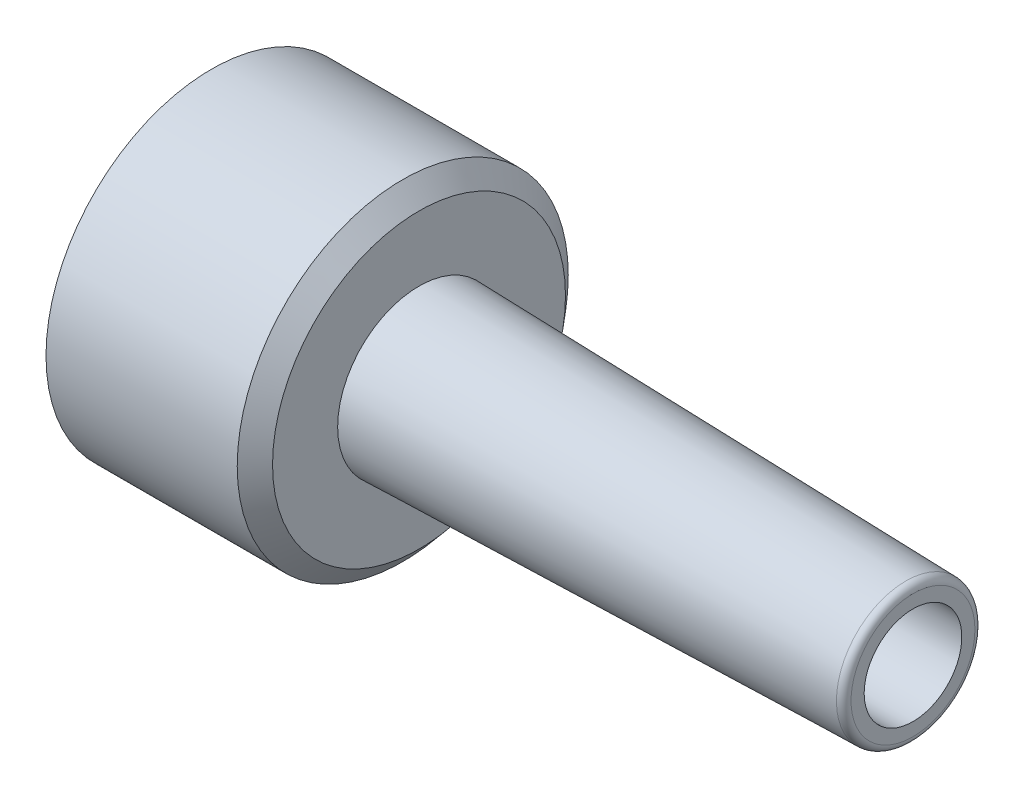
ISO-10303-21;
HEADER;
FILE_DESCRIPTION(('STEP AP214'),'2;1');
FILE_NAME('part.step','',(''),(''),'','','');
FILE_SCHEMA(('AUTOMOTIVE_DESIGN { 1 0 10303 214 1 1 1 1 }'));
ENDSEC;
DATA;
#1=APPLICATION_CONTEXT('core data for automotive mechanical design processes');
#2=APPLICATION_PROTOCOL_DEFINITION('international standard','automotive_design',2000,#1);
#3=PRODUCT_CONTEXT('',#1,'mechanical');
#4=PRODUCT('Part','Part','',(#3));
#5=PRODUCT_RELATED_PRODUCT_CATEGORY('part','',(#4));
#6=PRODUCT_DEFINITION_FORMATION('','',#4);
#7=PRODUCT_DEFINITION_CONTEXT('part definition',#1,'design');
#8=PRODUCT_DEFINITION('design','',#6,#7);
#9=PRODUCT_DEFINITION_SHAPE('','',#8);
#10=(LENGTH_UNIT() NAMED_UNIT(*) SI_UNIT(.MILLI.,.METRE.));
#11=(NAMED_UNIT(*) PLANE_ANGLE_UNIT() SI_UNIT($,.RADIAN.));
#12=(NAMED_UNIT(*) SI_UNIT($,.STERADIAN.) SOLID_ANGLE_UNIT());
#13=UNCERTAINTY_MEASURE_WITH_UNIT(LENGTH_MEASURE(1.E-05),#10,'distance_accuracy_value','');
#14=(GEOMETRIC_REPRESENTATION_CONTEXT(3) GLOBAL_UNCERTAINTY_ASSIGNED_CONTEXT((#13)) GLOBAL_UNIT_ASSIGNED_CONTEXT((#10,
#11,#12)) REPRESENTATION_CONTEXT('',''));
#15=CARTESIAN_POINT('',(0.,0.,0.));
#16=DIRECTION('',(0.,0.,1.));
#17=DIRECTION('',(1.,0.,0.));
#18=AXIS2_PLACEMENT_3D('',#15,#16,#17);
#19=CARTESIAN_POINT('',(0.,0.,0.));
#20=DIRECTION('',(-1.,0.,0.));
#21=DIRECTION('',(0.,0.,1.));
#22=AXIS2_PLACEMENT_3D('',#19,#20,#21);
#23=CYLINDRICAL_SURFACE('',#22,44.75);
#24=CARTESIAN_POINT('',(18.15,0.,-44.75));
#25=CARTESIAN_POINT('',(18.1499945488722,-0.123494927749459,-44.7499992762293));
#26=CARTESIAN_POINT('',(18.1395666697579,-0.247077499740812,-44.7494833178904));
#27=CARTESIAN_POINT('',(18.0981155717469,-0.490833627326368,-44.7474746598635));
#28=CARTESIAN_POINT('',(18.0670680693841,-0.611002989017102,-44.7459808085532));
#29=CARTESIAN_POINT('',(17.985268628475,-0.844366365600112,-44.7421854484618));
#30=CARTESIAN_POINT('',(17.9345267110427,-0.957563894085092,-44.7398843504894));
#31=CARTESIAN_POINT('',(17.8147941624646,-1.17380393254304,-44.7347336770827));
#32=CARTESIAN_POINT('',(17.7458078467614,-1.27684883606841,-44.7318842313954));
#33=CARTESIAN_POINT('',(17.5914692931732,-1.46999041533409,-44.7259542969457));
#34=CARTESIAN_POINT('',(17.5061030660289,-1.56007590718528,-44.7228736120729));
#35=CARTESIAN_POINT('',(17.3214557660902,-1.72464619438284,-44.7168301035337));
#36=CARTESIAN_POINT('',(17.2221741259064,-1.79913035328883,-44.7138672846796));
#37=CARTESIAN_POINT('',(17.012455991485,-1.93041415219686,-44.7083922360849));
#38=CARTESIAN_POINT('',(16.9020140547964,-1.98720510824268,-44.7058802278612));
#39=CARTESIAN_POINT('',(16.6731486896993,-2.08143468651145,-44.7015924477393));
#40=CARTESIAN_POINT('',(16.5547253203789,-2.11887345198473,-44.6998166703915));
#41=CARTESIAN_POINT('',(16.3133611326149,-2.1733064871318,-44.6972033658363));
#42=CARTESIAN_POINT('',(16.1904240801871,-2.19031741858537,-44.6963650740157));
#43=CARTESIAN_POINT('',(15.9434367404799,-2.20346331292136,-44.6957189765799));
#44=CARTESIAN_POINT('',(15.8193864617673,-2.199598436315,-44.6959111630416));
#45=CARTESIAN_POINT('',(15.5738072403004,-2.17111630930359,-44.6973036388683));
#46=CARTESIAN_POINT('',(15.4522762040688,-2.14651706064972,-44.6985030537461));
#47=CARTESIAN_POINT('',(15.2150705922525,-2.07729236680578,-44.7017734220128));
#48=CARTESIAN_POINT('',(15.0993960408037,-2.03266683909009,-44.7038443789931));
#49=CARTESIAN_POINT('',(14.8771289776468,-1.92463577738385,-44.7086254224244));
#50=CARTESIAN_POINT('',(14.7705404623624,-1.86122203386484,-44.7113357881598));
#51=CARTESIAN_POINT('',(14.5695148435931,-1.71742060873541,-44.7170898764529));
#52=CARTESIAN_POINT('',(14.4750778228626,-1.63703281153799,-44.7201336012806));
#53=CARTESIAN_POINT('',(14.3009311337782,-1.46146359444178,-44.7262152341611));
#54=CARTESIAN_POINT('',(14.2212371813438,-1.36626658478594,-44.7292531326292));
#55=CARTESIAN_POINT('',(14.0789599447368,-1.16383603544951,-44.7349776008798));
#56=CARTESIAN_POINT('',(14.0163766646833,-1.0566024928713,-44.7376641705778));
#57=CARTESIAN_POINT('',(13.9100988015862,-0.833133673858425,-44.742383310519));
#58=CARTESIAN_POINT('',(13.8664047641535,-0.716898137517841,-44.7444158618707));
#59=CARTESIAN_POINT('',(13.7991559597017,-0.47872890159023,-44.7475976141108));
#60=CARTESIAN_POINT('',(13.7756010469019,-0.356795243256808,-44.7487468213935));
#61=CARTESIAN_POINT('',(13.7493184933364,-0.110827454196659,-44.7500315447776));
#62=CARTESIAN_POINT('',(13.746569114149,0.0132043484220558,-44.750168118914));
#63=CARTESIAN_POINT('',(13.7619189466866,0.259967553824824,-44.749414992472));
#64=CARTESIAN_POINT('',(13.7800180917905,0.382698960763005,-44.7485252951731));
#65=CARTESIAN_POINT('',(13.8365332122944,0.623316582321508,-44.745820519086));
#66=CARTESIAN_POINT('',(13.874939264815,0.741205133087235,-44.7440058922761));
#67=CARTESIAN_POINT('',(13.970967933156,0.968862570993487,-44.7396555686356));
#68=CARTESIAN_POINT('',(14.0285906558843,1.07863141295755,-44.7371198677933));
#69=CARTESIAN_POINT('',(14.1614726399067,1.28703332686707,-44.7316100347473));
#70=CARTESIAN_POINT('',(14.2367464763206,1.38565709567348,-44.7286355409744));
#71=CARTESIAN_POINT('',(14.4027726395584,1.56887576152811,-44.7225843255316));
#72=CARTESIAN_POINT('',(14.4935250625632,1.6534705713966,-44.7195076032266));
#73=CARTESIAN_POINT('',(14.6880257691206,1.80630313943656,-44.713595696977));
#74=CARTESIAN_POINT('',(14.7917851099829,1.87452683482058,-44.7107607220311));
#75=CARTESIAN_POINT('',(15.0092984116042,1.99258444062114,-44.7056552786175));
#76=CARTESIAN_POINT('',(15.1230523299441,2.04241842908279,-44.7033848077539));
#77=CARTESIAN_POINT('',(15.3572735869729,2.12225748880577,-44.69966589237));
#78=CARTESIAN_POINT('',(15.4777378612756,2.15227153194348,-44.698217075954));
#79=CARTESIAN_POINT('',(15.7220031977855,2.19164805935166,-44.6963037998188));
#80=CARTESIAN_POINT('',(15.8458042418792,2.20101065570496,-44.6958393347571));
#81=CARTESIAN_POINT('',(16.0930888559282,2.19881744818283,-44.6959472714931));
#82=CARTESIAN_POINT('',(16.216572623202,2.18728376892946,-44.6965185766352));
#83=CARTESIAN_POINT('',(16.4598484167881,2.14367113370587,-44.6986313457847));
#84=CARTESIAN_POINT('',(16.5796404360464,2.11159213848143,-44.7001728116457));
#85=CARTESIAN_POINT('',(16.8121370147409,2.02780395724642,-44.7040519205361));
#86=CARTESIAN_POINT('',(16.9248415173798,1.97609461394788,-44.7063895699449));
#87=CARTESIAN_POINT('',(17.1399704967656,1.85451747074956,-44.711597496881));
#88=CARTESIAN_POINT('',(17.2423952917079,1.7846502331452,-44.7144677579141));
#89=CARTESIAN_POINT('',(17.4341677257808,1.6286616226739,-44.7204208602749));
#90=CARTESIAN_POINT('',(17.5235028591458,1.54252488354553,-44.7235039008078));
#91=CARTESIAN_POINT('',(17.6864724305659,1.35645141529364,-44.7295337022269));
#92=CARTESIAN_POINT('',(17.7601029993871,1.25651129531242,-44.7324804293889));
#93=CARTESIAN_POINT('',(17.88960661668,1.04559161752312,-44.7379075331921));
#94=CARTESIAN_POINT('',(17.9454628745439,0.934601750650587,-44.7403874679773));
#95=CARTESIAN_POINT('',(18.0376812070374,0.704890387065078,-44.7445948791337));
#96=CARTESIAN_POINT('',(18.0740663187698,0.586178214353183,-44.7463232442614));
#97=CARTESIAN_POINT('',(18.1167604996334,0.388939859681614,-44.7483753667762));
#98=CARTESIAN_POINT('',(18.1292094104752,0.311691369592295,-44.7489819285496));
#99=CARTESIAN_POINT('',(18.1458308825065,0.156306958167977,-44.7497944740664));
#100=CARTESIAN_POINT('',(18.1500034505086,0.0781710375634991,-44.7500004581395));
#101=CARTESIAN_POINT('',(18.15,0.,-44.75));
#102=B_SPLINE_CURVE_WITH_KNOTS('',3,(#24,#25,#26,#27,#28,#29,#30,#31,#32,#33,#34,#35,#36,#37,
#38,#39,#40,#41,#42,#43,#44,#45,#46,#47,#48,#49,#50,#51,#52,#53,#54,#55,#56,#57,#58,#59,#60,#61,
#62,#63,#64,#65,#66,#67,#68,#69,#70,#71,#72,#73,#74,#75,#76,#77,#78,#79,#80,#81,#82,#83,#84,#85,
#86,#87,#88,#89,#90,#91,#92,#93,#94,#95,#96,#97,#98,#99,#100,#101),.UNSPECIFIED.,.T.,.F.,(4,2,2,
2,2,2,2,2,2,2,2,2,2,2,2,2,2,2,2,2,2,2,2,2,2,2,2,2,2,2,2,2,2,2,2,2,2,2,4),(0.,0.370199430793141,
0.740835615659755,1.11128345634446,1.48164375132159,1.85232177174297,2.22301491065057,
2.59388970293868,2.96476174986845,3.33533109242828,3.70589758573571,4.07614268118651,
4.44638930238204,4.81679794237739,5.18720910479931,5.55801287368835,5.92881673184323,
6.29963129985568,6.67044318363833,7.04086757533781,7.4112907833562,7.78153315278499,
8.15177758201438,8.52232881786423,8.89288235633327,9.26375306989335,9.63462220947642,
10.0053233527764,10.376022484143,10.7463293549028,11.1166369331793,11.4869474786045,
11.8572465579913,12.2278971433011,12.598638942946,12.9697299334403,13.3403808949524,
13.5747135753166,13.8090460627952),.UNSPECIFIED.);
#103=CARTESIAN_POINT('',(18.15,0.,-44.75));
#104=VERTEX_POINT('',#103);
#105=EDGE_CURVE('E121',#104,#104,#102,.T.);
#106=ORIENTED_EDGE('',*,*,#105,.F.);
#107=EDGE_LOOP('',(#106));
#108=FACE_BOUND('',#107,.T.);
#109=CARTESIAN_POINT('',(63.8,0.,0.));
#110=DIRECTION('',(-1.,0.,0.));
#111=DIRECTION('',(0.,0.,1.));
#112=AXIS2_PLACEMENT_3D('',#109,#110,#111);
#113=CIRCLE('',#112,44.75);
#114=CARTESIAN_POINT('',(63.8,0.,44.75));
#115=VERTEX_POINT('',#114);
#116=EDGE_CURVE('E58',#115,#115,#113,.T.);
#117=ORIENTED_EDGE('',*,*,#116,.T.);
#118=EDGE_LOOP('',(#117));
#119=FACE_BOUND('',#118,.T.);
#120=CARTESIAN_POINT('',(12.1,0.,0.));
#121=DIRECTION('',(-1.,0.,0.));
#122=DIRECTION('',(0.,0.,1.));
#123=AXIS2_PLACEMENT_3D('',#120,#121,#122);
#124=CIRCLE('',#123,44.75);
#125=CARTESIAN_POINT('',(12.1,0.,44.75));
#126=VERTEX_POINT('',#125);
#127=EDGE_CURVE('E118',#126,#126,#124,.T.);
#128=ORIENTED_EDGE('',*,*,#127,.F.);
#129=EDGE_LOOP('',(#128));
#130=FACE_BOUND('',#129,.T.);
#131=ADVANCED_FACE('F34',(#108,#119,#130),#23,.T.);
#132=CARTESIAN_POINT('',(63.8,0.,0.));
#133=DIRECTION('',(-1.,0.,0.));
#134=DIRECTION('',(0.,0.,1.));
#135=AXIS2_PLACEMENT_3D('',#132,#133,#134);
#136=CONICAL_SURFACE('',#135,44.75,0.863771334323427);
#137=CARTESIAN_POINT('',(68.2,0.,0.));
#138=DIRECTION('',(-1.,0.,0.));
#139=DIRECTION('',(0.,0.,1.));
#140=AXIS2_PLACEMENT_3D('',#137,#138,#139);
#141=CIRCLE('',#140,39.6);
#142=CARTESIAN_POINT('',(68.2,0.,39.6));
#143=VERTEX_POINT('',#142);
#144=EDGE_CURVE('E61',#143,#143,#141,.T.);
#145=ORIENTED_EDGE('',*,*,#144,.T.);
#146=EDGE_LOOP('',(#145));
#147=FACE_BOUND('',#146,.T.);
#148=ORIENTED_EDGE('',*,*,#116,.F.);
#149=EDGE_LOOP('',(#148));
#150=FACE_BOUND('',#149,.T.);
#151=ADVANCED_FACE('F216',(#147,#150),#136,.T.);
#152=CARTESIAN_POINT('',(68.2,0.,39.6));
#153=DIRECTION('',(1.,0.,0.));
#154=DIRECTION('',(0.,0.,-1.));
#155=AXIS2_PLACEMENT_3D('',#152,#153,#154);
#156=PLANE('',#155);
#157=CARTESIAN_POINT('',(68.2,0.,0.));
#158=DIRECTION('',(-1.,0.,0.));
#159=DIRECTION('',(0.,0.,1.));
#160=AXIS2_PLACEMENT_3D('',#157,#158,#159);
#161=CIRCLE('',#160,22.);
#162=CARTESIAN_POINT('',(68.2,0.,22.));
#163=VERTEX_POINT('',#162);
#164=EDGE_CURVE('E64',#163,#163,#161,.T.);
#165=ORIENTED_EDGE('',*,*,#164,.T.);
#166=EDGE_LOOP('',(#165));
#167=FACE_BOUND('',#166,.T.);
#168=ORIENTED_EDGE('',*,*,#144,.F.);
#169=EDGE_LOOP('',(#168));
#170=FACE_BOUND('',#169,.T.);
#171=ADVANCED_FACE('F213',(#167,#170),#156,.T.);
#172=CARTESIAN_POINT('',(68.2,0.,0.));
#173=DIRECTION('',(-1.,0.,0.));
#174=DIRECTION('',(0.,0.,1.));
#175=AXIS2_PLACEMENT_3D('',#172,#173,#174);
#176=CONICAL_SURFACE('',#175,22.,0.0247048192570404);
#177=CARTESIAN_POINT('',(199.799404612652,0.,0.));
#178=DIRECTION('',(1.,0.,0.));
#179=DIRECTION('',(0.,0.,-1.));
#180=AXIS2_PLACEMENT_3D('',#177,#178,#179);
#181=CIRCLE('',#180,18.7481989126039);
#182=CARTESIAN_POINT('',(199.799404612652,0.,-18.7481989126039));
#183=VERTEX_POINT('',#182);
#184=EDGE_CURVE('E55',#183,#183,#181,.F.);
#185=ORIENTED_EDGE('',*,*,#184,.T.);
#186=EDGE_LOOP('',(#185));
#187=FACE_BOUND('',#186,.T.);
#188=ORIENTED_EDGE('',*,*,#164,.F.);
#189=EDGE_LOOP('',(#188));
#190=FACE_BOUND('',#189,.T.);
#191=ADVANCED_FACE('F209',(#187,#190),#176,.T.);
#192=CARTESIAN_POINT('',(201.75,0.,18.7));
#193=DIRECTION('',(1.,0.,0.));
#194=DIRECTION('',(0.,0.,-1.));
#195=AXIS2_PLACEMENT_3D('',#192,#193,#194);
#196=PLANE('',#195);
#197=CARTESIAN_POINT('',(201.75,0.,0.));
#198=DIRECTION('',(1.,0.,0.));
#199=DIRECTION('',(0.,0.,-1.));
#200=AXIS2_PLACEMENT_3D('',#197,#198,#199);
#201=CIRCLE('',#200,16.7488092096573);
#202=CARTESIAN_POINT('',(201.75,0.,-16.7488092096573));
#203=VERTEX_POINT('',#202);
#204=EDGE_CURVE('E50',#203,#203,#201,.T.);
#205=ORIENTED_EDGE('',*,*,#204,.T.);
#206=EDGE_LOOP('',(#205));
#207=FACE_BOUND('',#206,.T.);
#208=CARTESIAN_POINT('',(201.75,0.,0.));
#209=DIRECTION('',(-1.,0.,0.));
#210=DIRECTION('',(0.,0.,1.));
#211=AXIS2_PLACEMENT_3D('',#208,#209,#210);
#212=CIRCLE('',#211,13.2);
#213=CARTESIAN_POINT('',(201.75,0.,13.2));
#214=VERTEX_POINT('',#213);
#215=EDGE_CURVE('E67',#214,#214,#212,.T.);
#216=ORIENTED_EDGE('',*,*,#215,.T.);
#217=EDGE_LOOP('',(#216));
#218=FACE_BOUND('',#217,.T.);
#219=ADVANCED_FACE('F205',(#207,#218),#196,.T.);
#220=CARTESIAN_POINT('',(0.,0.,0.));
#221=DIRECTION('',(-1.,0.,0.));
#222=DIRECTION('',(0.,0.,1.));
#223=AXIS2_PLACEMENT_3D('',#220,#221,#222);
#224=CYLINDRICAL_SURFACE('',#223,13.2);
#225=CARTESIAN_POINT('',(157.75,0.,0.));
#226=DIRECTION('',(-1.,0.,0.));
#227=DIRECTION('',(0.,0.,1.));
#228=AXIS2_PLACEMENT_3D('',#225,#226,#227);
#229=CIRCLE('',#228,13.2);
#230=CARTESIAN_POINT('',(157.75,0.,13.2));
#231=VERTEX_POINT('',#230);
#232=EDGE_CURVE('E70',#231,#231,#229,.T.);
#233=ORIENTED_EDGE('',*,*,#232,.T.);
#234=EDGE_LOOP('',(#233));
#235=FACE_BOUND('',#234,.T.);
#236=ORIENTED_EDGE('',*,*,#215,.F.);
#237=EDGE_LOOP('',(#236));
#238=FACE_BOUND('',#237,.T.);
#239=ADVANCED_FACE('F201',(#235,#238),#224,.F.);
#240=CARTESIAN_POINT('',(158.016216557439,0.,0.));
#241=DIRECTION('',(-1.,0.,0.));
#242=DIRECTION('',(0.,0.,1.));
#243=AXIS2_PLACEMENT_3D('',#240,#241,#242);
#244=TOROIDAL_SURFACE('',#243,11.8337834425606,1.391911971813);
#245=CARTESIAN_POINT('',(156.65,0.,0.));
#246=DIRECTION('',(-1.,0.,0.));
#247=DIRECTION('',(0.,0.,1.));
#248=AXIS2_PLACEMENT_3D('',#245,#246,#247);
#249=CIRCLE('',#248,12.1);
#250=CARTESIAN_POINT('',(156.65,0.,12.1));
#251=VERTEX_POINT('',#250);
#252=EDGE_CURVE('E73',#251,#251,#249,.T.);
#253=ORIENTED_EDGE('',*,*,#252,.T.);
#254=EDGE_LOOP('',(#253));
#255=FACE_BOUND('',#254,.T.);
#256=ORIENTED_EDGE('',*,*,#232,.F.);
#257=EDGE_LOOP('',(#256));
#258=FACE_BOUND('',#257,.T.);
#259=ADVANCED_FACE('F197',(#255,#258),#244,.F.);
#260=CARTESIAN_POINT('',(0.,0.,0.));
#261=DIRECTION('',(-1.,0.,0.));
#262=DIRECTION('',(0.,0.,1.));
#263=AXIS2_PLACEMENT_3D('',#260,#261,#262);
#264=CYLINDRICAL_SURFACE('',#263,12.1);
#265=CARTESIAN_POINT('',(156.25,0.,0.));
#266=DIRECTION('',(-1.,0.,0.));
#267=DIRECTION('',(0.,0.,1.));
#268=AXIS2_PLACEMENT_3D('',#265,#266,#267);
#269=CIRCLE('',#268,12.1);
#270=CARTESIAN_POINT('',(156.25,0.,12.1));
#271=VERTEX_POINT('',#270);
#272=EDGE_CURVE('E76',#271,#271,#269,.T.);
#273=ORIENTED_EDGE('',*,*,#272,.T.);
#274=EDGE_LOOP('',(#273));
#275=FACE_BOUND('',#274,.T.);
#276=ORIENTED_EDGE('',*,*,#252,.F.);
#277=EDGE_LOOP('',(#276));
#278=FACE_BOUND('',#277,.T.);
#279=ADVANCED_FACE('F193',(#275,#278),#264,.F.);
#280=CARTESIAN_POINT('',(156.25,0.,12.1));
#281=DIRECTION('',(-1.,0.,0.));
#282=DIRECTION('',(0.,0.,1.));
#283=AXIS2_PLACEMENT_3D('',#280,#281,#282);
#284=PLANE('',#283);
#285=CARTESIAN_POINT('',(156.25,0.,0.));
#286=DIRECTION('',(-1.,0.,0.));
#287=DIRECTION('',(0.,0.,1.));
#288=AXIS2_PLACEMENT_3D('',#285,#286,#287);
#289=CIRCLE('',#288,13.2);
#290=CARTESIAN_POINT('',(156.25,0.,13.2));
#291=VERTEX_POINT('',#290);
#292=EDGE_CURVE('E79',#291,#291,#289,.T.);
#293=ORIENTED_EDGE('',*,*,#292,.T.);
#294=EDGE_LOOP('',(#293));
#295=FACE_BOUND('',#294,.T.);
#296=ORIENTED_EDGE('',*,*,#272,.F.);
#297=EDGE_LOOP('',(#296));
#298=FACE_BOUND('',#297,.T.);
#299=ADVANCED_FACE('F189',(#295,#298),#284,.T.);
#300=CARTESIAN_POINT('',(0.,0.,0.));
#301=DIRECTION('',(-1.,0.,0.));
#302=DIRECTION('',(0.,0.,1.));
#303=AXIS2_PLACEMENT_3D('',#300,#301,#302);
#304=CYLINDRICAL_SURFACE('',#303,13.2);
#305=CARTESIAN_POINT('',(155.15,0.,0.));
#306=DIRECTION('',(-1.,0.,0.));
#307=DIRECTION('',(0.,0.,1.));
#308=AXIS2_PLACEMENT_3D('',#305,#306,#307);
#309=CIRCLE('',#308,13.2);
#310=CARTESIAN_POINT('',(155.15,0.,13.2));
#311=VERTEX_POINT('',#310);
#312=EDGE_CURVE('E82',#311,#311,#309,.T.);
#313=ORIENTED_EDGE('',*,*,#312,.T.);
#314=EDGE_LOOP('',(#313));
#315=FACE_BOUND('',#314,.T.);
#316=ORIENTED_EDGE('',*,*,#292,.F.);
#317=EDGE_LOOP('',(#316));
#318=FACE_BOUND('',#317,.T.);
#319=ADVANCED_FACE('F185',(#315,#318),#304,.F.);
#320=CARTESIAN_POINT('',(155.15,0.,13.2));
#321=DIRECTION('',(1.,0.,0.));
#322=DIRECTION('',(0.,0.,-1.));
#323=AXIS2_PLACEMENT_3D('',#320,#321,#322);
#324=PLANE('',#323);
#325=CARTESIAN_POINT('',(155.15,0.,0.));
#326=DIRECTION('',(-1.,0.,0.));
#327=DIRECTION('',(0.,0.,1.));
#328=AXIS2_PLACEMENT_3D('',#325,#326,#327);
#329=CIRCLE('',#328,12.1);
#330=CARTESIAN_POINT('',(155.15,0.,12.1));
#331=VERTEX_POINT('',#330);
#332=EDGE_CURVE('E85',#331,#331,#329,.T.);
#333=ORIENTED_EDGE('',*,*,#332,.T.);
#334=EDGE_LOOP('',(#333));
#335=FACE_BOUND('',#334,.T.);
#336=ORIENTED_EDGE('',*,*,#312,.F.);
#337=EDGE_LOOP('',(#336));
#338=FACE_BOUND('',#337,.T.);
#339=ADVANCED_FACE('F181',(#335,#338),#324,.T.);
#340=CARTESIAN_POINT('',(0.,0.,0.));
#341=DIRECTION('',(-1.,0.,0.));
#342=DIRECTION('',(0.,0.,1.));
#343=AXIS2_PLACEMENT_3D('',#340,#341,#342);
#344=CYLINDRICAL_SURFACE('',#343,12.1);
#345=CARTESIAN_POINT('',(131.05,0.,0.));
#346=DIRECTION('',(-1.,0.,0.));
#347=DIRECTION('',(0.,0.,1.));
#348=AXIS2_PLACEMENT_3D('',#345,#346,#347);
#349=CIRCLE('',#348,12.1);
#350=CARTESIAN_POINT('',(131.05,0.,12.1));
#351=VERTEX_POINT('',#350);
#352=EDGE_CURVE('E88',#351,#351,#349,.T.);
#353=ORIENTED_EDGE('',*,*,#352,.T.);
#354=EDGE_LOOP('',(#353));
#355=FACE_BOUND('',#354,.T.);
#356=ORIENTED_EDGE('',*,*,#332,.F.);
#357=EDGE_LOOP('',(#356));
#358=FACE_BOUND('',#357,.T.);
#359=ADVANCED_FACE('F177',(#355,#358),#344,.F.);
#360=CARTESIAN_POINT('',(131.05,0.,12.1));
#361=DIRECTION('',(-1.,0.,0.));
#362=DIRECTION('',(0.,0.,1.));
#363=AXIS2_PLACEMENT_3D('',#360,#361,#362);
#364=PLANE('',#363);
#365=CARTESIAN_POINT('',(131.05,0.,0.));
#366=DIRECTION('',(-1.,0.,0.));
#367=DIRECTION('',(0.,0.,1.));
#368=AXIS2_PLACEMENT_3D('',#365,#366,#367);
#369=CIRCLE('',#368,12.6499999999999);
#370=CARTESIAN_POINT('',(131.05,0.,12.6499999999999));
#371=VERTEX_POINT('',#370);
#372=EDGE_CURVE('E91',#371,#371,#369,.T.);
#373=ORIENTED_EDGE('',*,*,#372,.T.);
#374=EDGE_LOOP('',(#373));
#375=FACE_BOUND('',#374,.T.);
#376=ORIENTED_EDGE('',*,*,#352,.F.);
#377=EDGE_LOOP('',(#376));
#378=FACE_BOUND('',#377,.T.);
#379=ADVANCED_FACE('F173',(#375,#378),#364,.T.);
#380=CARTESIAN_POINT('',(0.,0.,0.));
#381=DIRECTION('',(-1.,0.,0.));
#382=DIRECTION('',(0.,0.,1.));
#383=AXIS2_PLACEMENT_3D('',#380,#381,#382);
#384=CYLINDRICAL_SURFACE('',#383,12.6499999999999);
#385=CARTESIAN_POINT('',(129.95,0.,0.));
#386=DIRECTION('',(-1.,0.,0.));
#387=DIRECTION('',(0.,0.,1.));
#388=AXIS2_PLACEMENT_3D('',#385,#386,#387);
#389=CIRCLE('',#388,12.6499999999999);
#390=CARTESIAN_POINT('',(129.95,0.,12.6499999999999));
#391=VERTEX_POINT('',#390);
#392=EDGE_CURVE('E94',#391,#391,#389,.T.);
#393=ORIENTED_EDGE('',*,*,#392,.T.);
#394=EDGE_LOOP('',(#393));
#395=FACE_BOUND('',#394,.T.);
#396=ORIENTED_EDGE('',*,*,#372,.F.);
#397=EDGE_LOOP('',(#396));
#398=FACE_BOUND('',#397,.T.);
#399=ADVANCED_FACE('F169',(#395,#398),#384,.F.);
#400=CARTESIAN_POINT('',(129.95,0.,12.6499999999999));
#401=DIRECTION('',(1.,0.,0.));
#402=DIRECTION('',(0.,0.,-1.));
#403=AXIS2_PLACEMENT_3D('',#400,#401,#402);
#404=PLANE('',#403);
#405=CARTESIAN_POINT('',(129.95,0.,0.));
#406=DIRECTION('',(-1.,0.,0.));
#407=DIRECTION('',(0.,0.,1.));
#408=AXIS2_PLACEMENT_3D('',#405,#406,#407);
#409=CIRCLE('',#408,10.4499999999999);
#410=CARTESIAN_POINT('',(129.95,0.,10.4499999999999));
#411=VERTEX_POINT('',#410);
#412=EDGE_CURVE('E97',#411,#411,#409,.T.);
#413=ORIENTED_EDGE('',*,*,#412,.T.);
#414=EDGE_LOOP('',(#413));
#415=FACE_BOUND('',#414,.T.);
#416=ORIENTED_EDGE('',*,*,#392,.F.);
#417=EDGE_LOOP('',(#416));
#418=FACE_BOUND('',#417,.T.);
#419=ADVANCED_FACE('F165',(#415,#418),#404,.T.);
#420=CARTESIAN_POINT('',(0.,0.,0.));
#421=DIRECTION('',(-1.,0.,0.));
#422=DIRECTION('',(0.,0.,1.));
#423=AXIS2_PLACEMENT_3D('',#420,#421,#422);
#424=CYLINDRICAL_SURFACE('',#423,10.45);
#425=CARTESIAN_POINT('',(56.1,0.,0.));
#426=DIRECTION('',(-1.,0.,0.));
#427=DIRECTION('',(0.,0.,1.));
#428=AXIS2_PLACEMENT_3D('',#425,#426,#427);
#429=CIRCLE('',#428,10.45);
#430=CARTESIAN_POINT('',(56.1,0.,10.45));
#431=VERTEX_POINT('',#430);
#432=EDGE_CURVE('E100',#431,#431,#429,.T.);
#433=ORIENTED_EDGE('',*,*,#432,.T.);
#434=EDGE_LOOP('',(#433));
#435=FACE_BOUND('',#434,.T.);
#436=ORIENTED_EDGE('',*,*,#412,.F.);
#437=EDGE_LOOP('',(#436));
#438=FACE_BOUND('',#437,.T.);
#439=ADVANCED_FACE('F161',(#435,#438),#424,.F.);
#440=CARTESIAN_POINT('',(56.1,0.,10.45));
#441=DIRECTION('',(-1.,0.,0.));
#442=DIRECTION('',(0.,0.,1.));
#443=AXIS2_PLACEMENT_3D('',#440,#441,#442);
#444=PLANE('',#443);
#445=CARTESIAN_POINT('',(56.1,0.,0.));
#446=DIRECTION('',(-1.,0.,0.));
#447=DIRECTION('',(0.,0.,1.));
#448=AXIS2_PLACEMENT_3D('',#445,#446,#447);
#449=CIRCLE('',#448,26.);
#450=CARTESIAN_POINT('',(56.1,0.,26.));
#451=VERTEX_POINT('',#450);
#452=EDGE_CURVE('E103',#451,#451,#449,.T.);
#453=ORIENTED_EDGE('',*,*,#452,.T.);
#454=EDGE_LOOP('',(#453));
#455=FACE_BOUND('',#454,.T.);
#456=ORIENTED_EDGE('',*,*,#432,.F.);
#457=EDGE_LOOP('',(#456));
#458=FACE_BOUND('',#457,.T.);
#459=ADVANCED_FACE('F157',(#455,#458),#444,.T.);
#460=CARTESIAN_POINT('',(0.,0.,0.));
#461=DIRECTION('',(-1.,0.,0.));
#462=DIRECTION('',(0.,0.,1.));
#463=AXIS2_PLACEMENT_3D('',#460,#461,#462);
#464=CYLINDRICAL_SURFACE('',#463,26.);
#465=CARTESIAN_POINT('',(51.7,0.,0.));
#466=DIRECTION('',(-1.,0.,0.));
#467=DIRECTION('',(0.,0.,1.));
#468=AXIS2_PLACEMENT_3D('',#465,#466,#467);
#469=CIRCLE('',#468,26.);
#470=CARTESIAN_POINT('',(51.7,0.,26.));
#471=VERTEX_POINT('',#470);
#472=EDGE_CURVE('E106',#471,#471,#469,.T.);
#473=ORIENTED_EDGE('',*,*,#472,.T.);
#474=EDGE_LOOP('',(#473));
#475=FACE_BOUND('',#474,.T.);
#476=ORIENTED_EDGE('',*,*,#452,.F.);
#477=EDGE_LOOP('',(#476));
#478=FACE_BOUND('',#477,.T.);
#479=ADVANCED_FACE('F153',(#475,#478),#464,.F.);
#480=CARTESIAN_POINT('',(51.7,0.,26.));
#481=DIRECTION('',(-1.,0.,0.));
#482=DIRECTION('',(0.,0.,1.));
#483=AXIS2_PLACEMENT_3D('',#480,#481,#482);
#484=PLANE('',#483);
#485=CARTESIAN_POINT('',(51.7,0.,0.));
#486=DIRECTION('',(-1.,0.,0.));
#487=DIRECTION('',(0.,0.,1.));
#488=AXIS2_PLACEMENT_3D('',#485,#486,#487);
#489=CIRCLE('',#488,30.);
#490=CARTESIAN_POINT('',(51.7,0.,30.));
#491=VERTEX_POINT('',#490);
#492=EDGE_CURVE('E46',#491,#491,#489,.T.);
#493=ORIENTED_EDGE('',*,*,#492,.T.);
#494=EDGE_LOOP('',(#493));
#495=FACE_BOUND('',#494,.T.);
#496=ORIENTED_EDGE('',*,*,#472,.F.);
#497=EDGE_LOOP('',(#496));
#498=FACE_BOUND('',#497,.T.);
#499=ADVANCED_FACE('F150',(#495,#498),#484,.T.);
#500=CARTESIAN_POINT('',(0.,0.,0.));
#501=DIRECTION('',(-1.,0.,0.));
#502=DIRECTION('',(0.,0.,1.));
#503=AXIS2_PLACEMENT_3D('',#500,#501,#502);
#504=CYLINDRICAL_SURFACE('',#503,31.);
#505=CARTESIAN_POINT('',(50.7,0.,0.));
#506=DIRECTION('',(-1.,0.,0.));
#507=DIRECTION('',(0.,0.,1.));
#508=AXIS2_PLACEMENT_3D('',#505,#506,#507);
#509=CIRCLE('',#508,31.);
#510=CARTESIAN_POINT('',(50.7,0.,31.));
#511=VERTEX_POINT('',#510);
#512=EDGE_CURVE('E10',#511,#511,#509,.F.);
#513=ORIENTED_EDGE('',*,*,#512,.T.);
#514=EDGE_LOOP('',(#513));
#515=FACE_BOUND('',#514,.T.);
#516=CARTESIAN_POINT('',(23.1,0.,0.));
#517=DIRECTION('',(-1.,0.,0.));
#518=DIRECTION('',(0.,0.,1.));
#519=AXIS2_PLACEMENT_3D('',#516,#517,#518);
#520=CIRCLE('',#519,31.);
#521=CARTESIAN_POINT('',(23.1,0.,31.));
#522=VERTEX_POINT('',#521);
#523=EDGE_CURVE('E109',#522,#522,#520,.T.);
#524=ORIENTED_EDGE('',*,*,#523,.T.);
#525=EDGE_LOOP('',(#524));
#526=FACE_BOUND('',#525,.T.);
#527=ADVANCED_FACE('F146',(#515,#526),#504,.F.);
#528=CARTESIAN_POINT('',(23.1,0.,31.));
#529=DIRECTION('',(-1.,0.,0.));
#530=DIRECTION('',(0.,0.,1.));
#531=AXIS2_PLACEMENT_3D('',#528,#529,#530);
#532=PLANE('',#531);
#533=CARTESIAN_POINT('',(23.1,0.,0.));
#534=DIRECTION('',(-1.,0.,0.));
#535=DIRECTION('',(0.,0.,1.));
#536=AXIS2_PLACEMENT_3D('',#533,#534,#535);
#537=CIRCLE('',#536,32.1);
#538=CARTESIAN_POINT('',(23.1,0.,32.1));
#539=VERTEX_POINT('',#538);
#540=EDGE_CURVE('E112',#539,#539,#537,.T.);
#541=ORIENTED_EDGE('',*,*,#540,.T.);
#542=EDGE_LOOP('',(#541));
#543=FACE_BOUND('',#542,.T.);
#544=ORIENTED_EDGE('',*,*,#523,.F.);
#545=EDGE_LOOP('',(#544));
#546=FACE_BOUND('',#545,.T.);
#547=ADVANCED_FACE('F142',(#543,#546),#532,.T.);
#548=CARTESIAN_POINT('',(0.,0.,0.));
#549=DIRECTION('',(-1.,0.,0.));
#550=DIRECTION('',(0.,0.,1.));
#551=AXIS2_PLACEMENT_3D('',#548,#549,#550);
#552=CYLINDRICAL_SURFACE('',#551,32.0999999999999);
#553=CARTESIAN_POINT('',(18.15,0.,-32.1));
#554=CARTESIAN_POINT('',(18.1499945793315,0.123419552718964,-32.0999990014879));
#555=CARTESIAN_POINT('',(18.139579373772,0.246924899226615,-32.0992806003082));
#556=CARTESIAN_POINT('',(18.0981815533383,0.490523537590599,-32.0964838230801));
#557=CARTESIAN_POINT('',(18.067175165632,0.610612718118687,-32.094403875145));
#558=CARTESIAN_POINT('',(17.9854913284298,0.843815348312092,-32.0891192363293));
#559=CARTESIAN_POINT('',(17.9348244524212,0.956932509726932,-32.0859151501032));
#560=CARTESIAN_POINT('',(17.8152755057697,1.17302765691197,-32.0787423311087));
#561=CARTESIAN_POINT('',(17.7463975348244,1.27600791755865,-32.0747737704938));
#562=CARTESIAN_POINT('',(17.5922485568193,1.46911741492059,-32.0665100253888));
#563=CARTESIAN_POINT('',(17.506952056554,1.55922628202293,-32.06221433932));
#564=CARTESIAN_POINT('',(17.3224403066355,1.72386073822825,-32.0537847532371));
#565=CARTESIAN_POINT('',(17.2232244681117,1.79838566770581,-32.0496508600771));
#566=CARTESIAN_POINT('',(17.0135722598176,1.92980170232669,-32.0420070914109));
#567=CARTESIAN_POINT('',(16.9031250444974,1.98667554388969,-32.0384978282429));
#568=CARTESIAN_POINT('',(16.6742211763983,2.08106457259484,-32.0325056785126));
#569=CARTESIAN_POINT('',(16.5557646241103,2.11858000257035,-32.0300227790757));
#570=CARTESIAN_POINT('',(16.3144037136576,2.17312984724235,-32.0263682099705));
#571=CARTESIAN_POINT('',(16.1915067035777,2.19019663315287,-32.0251944680453));
#572=CARTESIAN_POINT('',(15.944587111693,2.2034646772351,-32.0242843769553));
#573=CARTESIAN_POINT('',(15.820564544835,2.19966621208105,-32.0245480087308));
#574=CARTESIAN_POINT('',(15.575135285684,2.17133840717769,-32.0264810121595));
#575=CARTESIAN_POINT('',(15.4537245244656,2.14684413534936,-32.0281480058748));
#576=CARTESIAN_POINT('',(15.2167418283727,2.07787443640208,-32.0326961425703));
#577=CARTESIAN_POINT('',(15.1011699342582,2.03339886981937,-32.0355772940252));
#578=CARTESIAN_POINT('',(14.8790332016007,1.92568941053612,-32.042231813073));
#579=CARTESIAN_POINT('',(14.7724760779049,1.86243965543349,-32.0460059345914));
#580=CARTESIAN_POINT('',(14.5714779985031,1.7189887239288,-32.0540203585182));
#581=CARTESIAN_POINT('',(14.477037207508,1.63878731712305,-32.0582606672626));
#582=CARTESIAN_POINT('',(14.3027486244644,1.46351241201291,-32.0667402009417));
#583=CARTESIAN_POINT('',(14.222931340423,1.36840857322625,-32.070979405593));
#584=CARTESIAN_POINT('',(14.0803909576015,1.16613468111222,-32.0789706372492));
#585=CARTESIAN_POINT('',(14.0176678659973,1.05896462271974,-32.0827226640495));
#586=CARTESIAN_POINT('',(13.9110987497113,0.835581604616916,-32.0893171554128));
#587=CARTESIAN_POINT('',(13.8672539314941,0.719368067520066,-32.0921595618412));
#588=CARTESIAN_POINT('',(13.7997065893106,0.481205448591592,-32.096613780812));
#589=CARTESIAN_POINT('',(13.7760037825705,0.359256447305542,-32.0982256106305));
#590=CARTESIAN_POINT('',(13.7494512179774,0.113349212967646,-32.1000348328276));
#591=CARTESIAN_POINT('',(13.7465592905743,-0.0106044465803645,-32.1002350854997));
#592=CARTESIAN_POINT('',(13.7616003186004,-0.257235023098068,-32.0992062050484));
#593=CARTESIAN_POINT('',(13.779533143373,-0.379911948073255,-32.0979770808931));
#594=CARTESIAN_POINT('',(13.8356797031015,-0.620387538203844,-32.0942296184746));
#595=CARTESIAN_POINT('',(13.8738740387807,-0.738190753562338,-32.0917125134635));
#596=CARTESIAN_POINT('',(13.9694396926336,-0.965715499222009,-32.0856721596857));
#597=CARTESIAN_POINT('',(14.026811217768,-1.07543694228889,-32.0821489000606));
#598=CARTESIAN_POINT('',(14.1592096742609,-1.28387635283824,-32.0744847464741));
#599=CARTESIAN_POINT('',(14.2342647105883,-1.38257643179978,-32.0703428732066));
#600=CARTESIAN_POINT('',(14.399858825458,-1.56599117336074,-32.0619107055332));
#601=CARTESIAN_POINT('',(14.490398086565,-1.65070567104196,-32.0576204093777));
#602=CARTESIAN_POINT('',(14.6845727873375,-1.80388783665748,-32.0493666027471));
#603=CARTESIAN_POINT('',(14.788229869319,-1.87232810485485,-32.0454036506146));
#604=CARTESIAN_POINT('',(15.0055892737004,-1.99083150842718,-32.0382603974079));
#605=CARTESIAN_POINT('',(15.119291524027,-2.04089477564235,-32.035080090719));
#606=CARTESIAN_POINT('',(15.3534143948423,-2.12117581694924,-32.0298648352192));
#607=CARTESIAN_POINT('',(15.4738291213249,-2.15141071290805,-32.0278288984587));
#608=CARTESIAN_POINT('',(15.7180403773557,-2.19123262878054,-32.0251292598698));
#609=CARTESIAN_POINT('',(15.8418368651977,-2.20081990321837,-32.0244655411262));
#610=CARTESIAN_POINT('',(16.0890251345128,-2.19907186826569,-32.0245856025246));
#611=CARTESIAN_POINT('',(16.2124172242983,-2.18777962663042,-32.0253664030878));
#612=CARTESIAN_POINT('',(16.4555486859977,-2.1446825325377,-32.0282812031241));
#613=CARTESIAN_POINT('',(16.5752880515258,-2.1128776442215,-32.0304152049627));
#614=CARTESIAN_POINT('',(16.8077205403734,-2.02966813299633,-32.0357951908776));
#615=CARTESIAN_POINT('',(16.9204137900454,-1.97826386166492,-32.0390411550071));
#616=CARTESIAN_POINT('',(17.1355765469291,-1.85732027466633,-32.0462792729874));
#617=CARTESIAN_POINT('',(17.2380462915577,-1.78778138026891,-32.0502714095037));
#618=CARTESIAN_POINT('',(17.4300725261041,-1.63238210577633,-32.058561692382));
#619=CARTESIAN_POINT('',(17.5196035525745,-1.5464902922685,-32.0628604179473));
#620=CARTESIAN_POINT('',(17.6830088588052,-1.36087127106858,-32.0712743991007));
#621=CARTESIAN_POINT('',(17.756879313962,-1.26114069350884,-32.0753896096776));
#622=CARTESIAN_POINT('',(17.8869323586703,-1.05054142294761,-32.0829779334029));
#623=CARTESIAN_POINT('',(17.9430900956263,-0.9396573655558,-32.0864501415654));
#624=CARTESIAN_POINT('',(18.0359213710676,-0.710089740508287,-32.092349587134));
#625=CARTESIAN_POINT('',(18.0726176191549,-0.591415445889585,-32.0947780418651));
#626=CARTESIAN_POINT('',(18.1159963572805,-0.393351408206707,-32.0976833288434));
#627=CARTESIAN_POINT('',(18.12873111594,-0.315240345959779,-32.0985481952616));
#628=CARTESIAN_POINT('',(18.1457346664463,-0.158097924974533,-32.0997068501951));
#629=CARTESIAN_POINT('',(18.150003472656,-0.0790665677977534,-32.1000006396792));
#630=CARTESIAN_POINT('',(18.15,0.,-32.1));
#631=B_SPLINE_CURVE_WITH_KNOTS('',3,(#553,#554,#555,#556,#557,#558,#559,#560,#561,#562,#563,
#564,#565,#566,#567,#568,#569,#570,#571,#572,#573,#574,#575,#576,#577,#578,#579,#580,#581,#582,
#583,#584,#585,#586,#587,#588,#589,#590,#591,#592,#593,#594,#595,#596,#597,#598,#599,#600,#601,
#602,#603,#604,#605,#606,#607,#608,#609,#610,#611,#612,#613,#614,#615,#616,#617,#618,#619,#620,
#621,#622,#623,#624,#625,#626,#627,#628,#629,#630),.UNSPECIFIED.,.T.,.F.,(4,2,2,2,2,2,2,2,2,2,2,
2,2,2,2,2,2,2,2,2,2,2,2,2,2,2,2,2,2,2,2,2,2,2,2,2,2,2,4),(0.,0.369970008156527,
0.740367896592526,1.11056685907145,1.48068255289258,1.8513776333867,2.22208840121435,
2.59316060695994,2.96422815783493,3.33470751102364,3.7051819516504,4.0750298994524,
4.44488042872804,4.81504434031812,5.18521328343043,5.5561459026938,5.92707867766682,
6.29803515453397,6.6689864234556,7.03918581332353,7.40938288053452,7.77922614254128,
8.14907339603504,8.51951247266035,8.88995591719753,9.26101870308427,9.63207882684193,
10.002818115534,10.37355283408,10.7435236985542,11.1134952097871,11.4834600847112,
11.8534163660665,12.224091087399,12.5948562303902,12.9661393008121,13.3369881625814,
13.5740033495281,13.8110181343706),.UNSPECIFIED.);
#632=CARTESIAN_POINT('',(18.15,0.,-32.1));
#633=VERTEX_POINT('',#632);
#634=EDGE_CURVE('E38',#633,#633,#631,.T.);
#635=ORIENTED_EDGE('',*,*,#634,.F.);
#636=EDGE_LOOP('',(#635));
#637=FACE_BOUND('',#636,.T.);
#638=CARTESIAN_POINT('',(8.8,0.,0.));
#639=DIRECTION('',(-1.,0.,0.));
#640=DIRECTION('',(0.,0.,1.));
#641=AXIS2_PLACEMENT_3D('',#638,#639,#640);
#642=CIRCLE('',#641,32.0999999999999);
#643=CARTESIAN_POINT('',(8.8,0.,32.0999999999999));
#644=VERTEX_POINT('',#643);
#645=EDGE_CURVE('E115',#644,#644,#642,.T.);
#646=ORIENTED_EDGE('',*,*,#645,.T.);
#647=EDGE_LOOP('',(#646));
#648=FACE_BOUND('',#647,.T.);
#649=ORIENTED_EDGE('',*,*,#540,.F.);
#650=EDGE_LOOP('',(#649));
#651=FACE_BOUND('',#650,.T.);
#652=ADVANCED_FACE('F137',(#637,#648,#651),#552,.F.);
#653=CARTESIAN_POINT('',(8.8,0.,0.));
#654=DIRECTION('',(1.,0.,0.));
#655=DIRECTION('',(0.,0.,-1.));
#656=AXIS2_PLACEMENT_3D('',#653,#654,#655);
#657=CONICAL_SURFACE('',#656,32.0999999999999,1.31561393617408);
#658=ORIENTED_EDGE('',*,*,#127,.T.);
#659=EDGE_LOOP('',(#658));
#660=FACE_BOUND('',#659,.T.);
#661=ORIENTED_EDGE('',*,*,#645,.F.);
#662=EDGE_LOOP('',(#661));
#663=FACE_BOUND('',#662,.T.);
#664=ADVANCED_FACE('F133',(#660,#663),#657,.T.);
#665=CARTESIAN_POINT('',(199.75,0.,0.));
#666=DIRECTION('',(1.,0.,0.));
#667=DIRECTION('',(0.,0.,-1.));
#668=AXIS2_PLACEMENT_3D('',#665,#666,#667);
#669=TOROIDAL_SURFACE('',#668,16.7488092096573,2.);
#670=ORIENTED_EDGE('',*,*,#204,.F.);
#671=EDGE_LOOP('',(#670));
#672=FACE_BOUND('',#671,.T.);
#673=ORIENTED_EDGE('',*,*,#184,.F.);
#674=EDGE_LOOP('',(#673));
#675=FACE_BOUND('',#674,.T.);
#676=ADVANCED_FACE('F136',(#672,#675),#669,.T.);
#677=CARTESIAN_POINT('',(50.7,0.,0.));
#678=DIRECTION('',(-1.,0.,0.));
#679=DIRECTION('',(0.,0.,1.));
#680=AXIS2_PLACEMENT_3D('',#677,#678,#679);
#681=TOROIDAL_SURFACE('',#680,30.,1.);
#682=ORIENTED_EDGE('',*,*,#512,.F.);
#683=EDGE_LOOP('',(#682));
#684=FACE_BOUND('',#683,.T.);
#685=ORIENTED_EDGE('',*,*,#492,.F.);
#686=EDGE_LOOP('',(#685));
#687=FACE_BOUND('',#686,.T.);
#688=ADVANCED_FACE('F36',(#684,#687),#681,.F.);
#689=CARTESIAN_POINT('',(15.95,0.,-44.75));
#690=DIRECTION('',(0.,0.,1.));
#691=DIRECTION('',(1.,0.,0.));
#692=AXIS2_PLACEMENT_3D('',#689,#690,#691);
#693=CYLINDRICAL_SURFACE('',#692,2.2);
#694=ORIENTED_EDGE('',*,*,#105,.T.);
#695=EDGE_LOOP('',(#694));
#696=FACE_BOUND('',#695,.T.);
#697=ORIENTED_EDGE('',*,*,#634,.T.);
#698=EDGE_LOOP('',(#697));
#699=FACE_BOUND('',#698,.T.);
#700=ADVANCED_FACE('F128',(#696,#699),#693,.F.);
#701=CLOSED_SHELL('',(#131,#151,#171,#191,#219,#239,#259,#279,#299,#319,#339,#359,#379,#399,
#419,#439,#459,#479,#499,#527,#547,#652,#664,#676,#688,#700));
#702=MANIFOLD_SOLID_BREP('B2',#701);
#703=ADVANCED_BREP_SHAPE_REPRESENTATION('',(#18,#702),#14);
#704=SHAPE_DEFINITION_REPRESENTATION(#9,#703);
ENDSEC;
END-ISO-10303-21;
